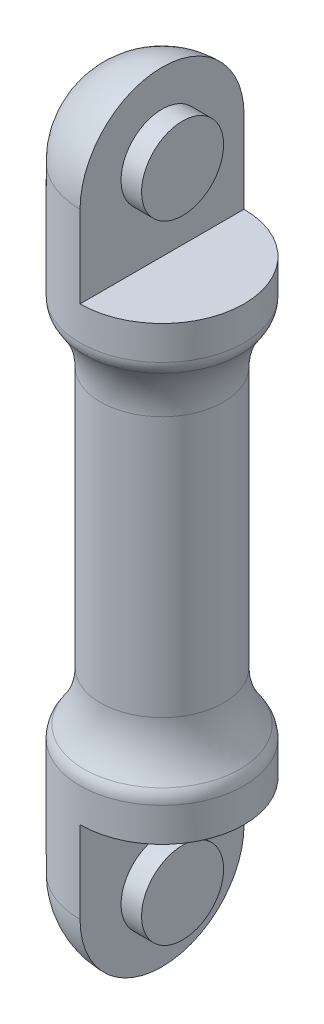
ISO-10303-21;
HEADER;
FILE_DESCRIPTION(('STEP AP214'),'2;1');
FILE_NAME('part.step','',(''),(''),'','','');
FILE_SCHEMA(('AUTOMOTIVE_DESIGN { 1 0 10303 214 1 1 1 1 }'));
ENDSEC;
DATA;
#1=APPLICATION_CONTEXT('core data for automotive mechanical design processes');
#2=APPLICATION_PROTOCOL_DEFINITION('international standard','automotive_design',2000,#1);
#3=PRODUCT_CONTEXT('',#1,'mechanical');
#4=PRODUCT('Part','Part','',(#3));
#5=PRODUCT_RELATED_PRODUCT_CATEGORY('part','',(#4));
#6=PRODUCT_DEFINITION_FORMATION('','',#4);
#7=PRODUCT_DEFINITION_CONTEXT('part definition',#1,'design');
#8=PRODUCT_DEFINITION('design','',#6,#7);
#9=PRODUCT_DEFINITION_SHAPE('','',#8);
#10=(LENGTH_UNIT() NAMED_UNIT(*) SI_UNIT(.MILLI.,.METRE.));
#11=(NAMED_UNIT(*) PLANE_ANGLE_UNIT() SI_UNIT($,.RADIAN.));
#12=(NAMED_UNIT(*) SI_UNIT($,.STERADIAN.) SOLID_ANGLE_UNIT());
#13=UNCERTAINTY_MEASURE_WITH_UNIT(LENGTH_MEASURE(1.E-05),#10,'distance_accuracy_value','');
#14=(GEOMETRIC_REPRESENTATION_CONTEXT(3) GLOBAL_UNCERTAINTY_ASSIGNED_CONTEXT((#13)) GLOBAL_UNIT_ASSIGNED_CONTEXT((#10,
#11,#12)) REPRESENTATION_CONTEXT('',''));
#15=CARTESIAN_POINT('',(0.,0.,0.));
#16=DIRECTION('',(0.,0.,1.));
#17=DIRECTION('',(1.,0.,0.));
#18=AXIS2_PLACEMENT_3D('',#15,#16,#17);
#19=CARTESIAN_POINT('',(0.,100.,0.));
#20=DIRECTION('',(0.,-1.,0.));
#21=DIRECTION('',(0.,0.,-1.));
#22=AXIS2_PLACEMENT_3D('',#19,#20,#21);
#23=CYLINDRICAL_SURFACE('',#22,40.);
#24=CARTESIAN_POINT('',(0.,96.4575131106459,0.));
#25=DIRECTION('',(0.,-1.,0.));
#26=DIRECTION('',(0.,0.,-1.));
#27=AXIS2_PLACEMENT_3D('',#24,#25,#26);
#28=CIRCLE('',#27,40.);
#29=CARTESIAN_POINT('',(0.,96.4575131106459,-40.));
#30=VERTEX_POINT('',#29);
#31=EDGE_CURVE('E11',#30,#30,#28,.T.);
#32=ORIENTED_EDGE('',*,*,#31,.T.);
#33=EDGE_LOOP('',(#32));
#34=FACE_BOUND('',#33,.T.);
#35=DIRECTION('',(0.,-1.,0.));
#36=VECTOR('',#35,1.);
#37=CARTESIAN_POINT('',(0.,100.,-40.));
#38=LINE('',#37,#36);
#39=CARTESIAN_POINT('',(0.,80.,-40.));
#40=VERTEX_POINT('',#39);
#41=CARTESIAN_POINT('',(0.,40.,-40.));
#42=VERTEX_POINT('',#41);
#43=EDGE_CURVE('E93',#40,#42,#38,.T.);
#44=ORIENTED_EDGE('',*,*,#43,.T.);
#45=CARTESIAN_POINT('',(0.,40.,0.));
#46=DIRECTION('',(0.,-1.,0.));
#47=DIRECTION('',(0.,0.,-1.));
#48=AXIS2_PLACEMENT_3D('',#45,#46,#47);
#49=CIRCLE('',#48,40.);
#50=CARTESIAN_POINT('',(0.,40.,40.));
#51=VERTEX_POINT('',#50);
#52=EDGE_CURVE('E90',#42,#51,#49,.F.);
#53=ORIENTED_EDGE('',*,*,#52,.T.);
#54=DIRECTION('',(0.,-1.,0.));
#55=VECTOR('',#54,1.);
#56=CARTESIAN_POINT('',(0.,100.,40.));
#57=LINE('',#56,#55);
#58=CARTESIAN_POINT('',(0.,80.,40.));
#59=VERTEX_POINT('',#58);
#60=EDGE_CURVE('E85',#51,#59,#57,.F.);
#61=ORIENTED_EDGE('',*,*,#60,.T.);
#62=CARTESIAN_POINT('',(0.,80.,0.));
#63=DIRECTION('',(0.,1.,0.));
#64=DIRECTION('',(0.,0.,1.));
#65=AXIS2_PLACEMENT_3D('',#62,#63,#64);
#66=CIRCLE('',#65,40.);
#67=EDGE_CURVE('E88',#59,#40,#66,.T.);
#68=ORIENTED_EDGE('',*,*,#67,.T.);
#69=EDGE_LOOP('',(#44,#53,#61,#68));
#70=FACE_BOUND('',#69,.T.);
#71=ADVANCED_FACE('F37',(#34,#70),#23,.T.);
#72=CARTESIAN_POINT('',(0.,280.,0.));
#73=DIRECTION('',(0.,-1.,0.));
#74=DIRECTION('',(0.,0.,-1.));
#75=AXIS2_PLACEMENT_3D('',#72,#73,#74);
#76=CYLINDRICAL_SURFACE('',#75,30.);
#77=CARTESIAN_POINT('',(0.,253.542486889354,0.));
#78=DIRECTION('',(0.,1.,0.));
#79=DIRECTION('',(0.,0.,1.));
#80=AXIS2_PLACEMENT_3D('',#77,#78,#79);
#81=CIRCLE('',#80,30.);
#82=CARTESIAN_POINT('',(0.,253.542486889354,-30.));
#83=VERTEX_POINT('',#82);
#84=EDGE_CURVE('E137',#83,#83,#81,.F.);
#85=CARTESIAN_POINT('',(0.,126.457513110646,0.));
#86=DIRECTION('',(0.,-1.,0.));
#87=DIRECTION('',(0.,0.,-1.));
#88=AXIS2_PLACEMENT_3D('',#85,#86,#87);
#89=CIRCLE('',#88,30.);
#90=CARTESIAN_POINT('',(0.,126.457513110646,-30.));
#91=VERTEX_POINT('',#90);
#92=EDGE_CURVE('E134',#91,#91,#89,.F.);
#93=CARTESIAN_POINT('',(0.,253.542486889354,-30.));
#94=CARTESIAN_POINT('',(0.,252.218685079159,-30.));
#95=CARTESIAN_POINT('',(0.,250.894883268964,-30.));
#96=CARTESIAN_POINT('',(0.,248.247279648575,-30.));
#97=CARTESIAN_POINT('',(0.,246.92347783838,-30.));
#98=CARTESIAN_POINT('',(0.,244.27587421799,-30.));
#99=CARTESIAN_POINT('',(0.,242.952072407795,-30.));
#100=CARTESIAN_POINT('',(0.,240.304468787405,-30.));
#101=CARTESIAN_POINT('',(0.,238.98066697721,-30.));
#102=CARTESIAN_POINT('',(0.,236.333063356821,-30.));
#103=CARTESIAN_POINT('',(0.,235.009261546626,-30.));
#104=CARTESIAN_POINT('',(0.,232.361657926236,-30.));
#105=CARTESIAN_POINT('',(0.,231.037856116041,-30.));
#106=CARTESIAN_POINT('',(0.,228.390252495651,-30.));
#107=CARTESIAN_POINT('',(0.,227.066450685457,-30.));
#108=CARTESIAN_POINT('',(0.,224.418847065067,-30.));
#109=CARTESIAN_POINT('',(0.,223.095045254872,-30.));
#110=CARTESIAN_POINT('',(0.,220.447441634482,-30.));
#111=CARTESIAN_POINT('',(0.,219.123639824287,-30.));
#112=CARTESIAN_POINT('',(0.,216.476036203898,-30.));
#113=CARTESIAN_POINT('',(0.,215.152234393703,-30.));
#114=CARTESIAN_POINT('',(0.,212.504630773313,-30.));
#115=CARTESIAN_POINT('',(0.,211.180828963118,-30.));
#116=CARTESIAN_POINT('',(0.,208.533225342728,-30.));
#117=CARTESIAN_POINT('',(0.,207.209423532533,-30.));
#118=CARTESIAN_POINT('',(0.,204.561819912144,-30.));
#119=CARTESIAN_POINT('',(0.,203.238018101949,-30.));
#120=CARTESIAN_POINT('',(0.,200.590414481559,-30.));
#121=CARTESIAN_POINT('',(0.,199.266612671364,-30.));
#122=CARTESIAN_POINT('',(0.,196.619009050974,-30.));
#123=CARTESIAN_POINT('',(0.,195.29520724078,-30.));
#124=CARTESIAN_POINT('',(0.,192.64760362039,-30.));
#125=CARTESIAN_POINT('',(0.,191.323801810195,-30.));
#126=CARTESIAN_POINT('',(0.,188.676198189805,-30.));
#127=CARTESIAN_POINT('',(0.,187.35239637961,-30.));
#128=CARTESIAN_POINT('',(0.,184.70479275922,-30.));
#129=CARTESIAN_POINT('',(0.,183.380990949026,-30.));
#130=CARTESIAN_POINT('',(0.,180.733387328636,-30.));
#131=CARTESIAN_POINT('',(0.,179.409585518441,-30.));
#132=CARTESIAN_POINT('',(0.,176.761981898051,-30.));
#133=CARTESIAN_POINT('',(0.,175.438180087856,-30.));
#134=CARTESIAN_POINT('',(0.,172.790576467467,-30.));
#135=CARTESIAN_POINT('',(0.,171.466774657272,-30.));
#136=CARTESIAN_POINT('',(0.,168.819171036882,-30.));
#137=CARTESIAN_POINT('',(0.,167.495369226687,-30.));
#138=CARTESIAN_POINT('',(0.,164.847765606297,-30.));
#139=CARTESIAN_POINT('',(0.,163.523963796102,-30.));
#140=CARTESIAN_POINT('',(0.,160.876360175713,-30.));
#141=CARTESIAN_POINT('',(0.,159.552558365518,-30.));
#142=CARTESIAN_POINT('',(0.,156.904954745128,-30.));
#143=CARTESIAN_POINT('',(0.,155.581152934933,-30.));
#144=CARTESIAN_POINT('',(0.,152.933549314543,-30.));
#145=CARTESIAN_POINT('',(0.,151.609747504349,-30.));
#146=CARTESIAN_POINT('',(0.,148.962143883959,-30.));
#147=CARTESIAN_POINT('',(0.,147.638342073764,-30.));
#148=CARTESIAN_POINT('',(0.,144.990738453374,-30.));
#149=CARTESIAN_POINT('',(0.,143.666936643179,-30.));
#150=CARTESIAN_POINT('',(0.,141.01933302279,-30.));
#151=CARTESIAN_POINT('',(0.,139.695531212595,-30.));
#152=CARTESIAN_POINT('',(0.,137.047927592205,-30.));
#153=CARTESIAN_POINT('',(0.,135.72412578201,-30.));
#154=CARTESIAN_POINT('',(0.,133.07652216162,-30.));
#155=CARTESIAN_POINT('',(0.,131.752720351425,-30.));
#156=CARTESIAN_POINT('',(0.,129.105116731036,-30.));
#157=CARTESIAN_POINT('',(0.,127.781314920841,-30.));
#158=CARTESIAN_POINT('',(0.,126.457513110646,-30.));
#159=B_SPLINE_CURVE_WITH_KNOTS('',3,(#93,#94,#95,#96,#97,#98,#99,#100,#101,#102,#103,#104,#105,
#106,#107,#108,#109,#110,#111,#112,#113,#114,#115,#116,#117,#118,#119,#120,#121,#122,#123,#124,
#125,#126,#127,#128,#129,#130,#131,#132,#133,#134,#135,#136,#137,#138,#139,#140,#141,#142,#143,
#144,#145,#146,#147,#148,#149,#150,#151,#152,#153,#154,#155,#156,#157,#158),.UNSPECIFIED.,.F.,
.F.,(4,2,2,2,2,2,2,2,2,2,2,2,2,2,2,2,2,2,2,2,2,2,2,2,2,2,2,2,2,2,2,2,4),(0.,3.97140543058461,
7.94281086116924,11.9142162917539,15.8856217223385,19.8570271529231,23.8284325835078,
27.7998380140924,31.771243444677,35.7426488752616,39.7140543058463,43.6854597364309,
47.6568651670155,51.6282705976002,55.5996760281848,59.5710814587694,63.542486889354,
67.5138923199387,71.4852977505233,75.4567031811079,79.4281086116926,83.3995140422772,
87.3709194728619,91.3423249034465,95.3137303340311,99.2851357646157,103.2565411952,
107.227946625785,111.19935205637,115.170757486954,119.142162917539,123.113568348123,
127.084973778708),.UNSPECIFIED.);
#160=EDGE_CURVE('BSEAM161',#83,#91,#159,.T.);
#161=ORIENTED_EDGE('',*,*,#84,.T.);
#162=ORIENTED_EDGE('',*,*,#92,.T.);
#163=ORIENTED_EDGE('',*,*,#160,.T.);
#164=ORIENTED_EDGE('',*,*,#160,.F.);
#165=EDGE_LOOP('',(#161,#163,#162,#164));
#166=FACE_BOUND('',#165,.T.);
#167=ADVANCED_FACE('F161',(#166),#76,.T.);
#168=CARTESIAN_POINT('',(0.,380.,0.));
#169=DIRECTION('',(0.,-1.,0.));
#170=DIRECTION('',(0.,0.,-1.));
#171=AXIS2_PLACEMENT_3D('',#168,#169,#170);
#172=CYLINDRICAL_SURFACE('',#171,40.);
#173=CARTESIAN_POINT('',(0.,283.542486889354,0.));
#174=DIRECTION('',(0.,-1.,0.));
#175=DIRECTION('',(0.,0.,-1.));
#176=AXIS2_PLACEMENT_3D('',#173,#174,#175);
#177=CIRCLE('',#176,40.);
#178=CARTESIAN_POINT('',(0.,283.542486889354,-40.));
#179=VERTEX_POINT('',#178);
#180=EDGE_CURVE('E140',#179,#179,#177,.F.);
#181=ORIENTED_EDGE('',*,*,#180,.T.);
#182=EDGE_LOOP('',(#181));
#183=FACE_BOUND('',#182,.T.);
#184=DIRECTION('',(0.,-1.,0.));
#185=VECTOR('',#184,1.);
#186=CARTESIAN_POINT('',(0.,380.,40.));
#187=LINE('',#186,#185);
#188=CARTESIAN_POINT('',(0.,300.,40.));
#189=VERTEX_POINT('',#188);
#190=CARTESIAN_POINT('',(0.,340.,40.));
#191=VERTEX_POINT('',#190);
#192=EDGE_CURVE('E113',#189,#191,#187,.F.);
#193=ORIENTED_EDGE('',*,*,#192,.T.);
#194=CARTESIAN_POINT('',(0.,340.,0.));
#195=DIRECTION('',(0.,-1.,0.));
#196=DIRECTION('',(0.,0.,-1.));
#197=AXIS2_PLACEMENT_3D('',#194,#195,#196);
#198=CIRCLE('',#197,40.);
#199=CARTESIAN_POINT('',(0.,340.,-40.));
#200=VERTEX_POINT('',#199);
#201=EDGE_CURVE('E126',#191,#200,#198,.T.);
#202=ORIENTED_EDGE('',*,*,#201,.T.);
#203=DIRECTION('',(0.,-1.,0.));
#204=VECTOR('',#203,1.);
#205=CARTESIAN_POINT('',(0.,380.,-40.));
#206=LINE('',#205,#204);
#207=CARTESIAN_POINT('',(0.,300.,-40.));
#208=VERTEX_POINT('',#207);
#209=EDGE_CURVE('E115',#200,#208,#206,.T.);
#210=ORIENTED_EDGE('',*,*,#209,.T.);
#211=CARTESIAN_POINT('',(0.,300.,0.));
#212=DIRECTION('',(0.,-1.,0.));
#213=DIRECTION('',(0.,0.,-1.));
#214=AXIS2_PLACEMENT_3D('',#211,#212,#213);
#215=CIRCLE('',#214,40.);
#216=EDGE_CURVE('E99',#208,#189,#215,.T.);
#217=ORIENTED_EDGE('',*,*,#216,.T.);
#218=EDGE_LOOP('',(#193,#202,#210,#217));
#219=FACE_BOUND('',#218,.T.);
#220=ADVANCED_FACE('F167',(#183,#219),#172,.T.);
#221=CARTESIAN_POINT('',(0.,300.,0.));
#222=DIRECTION('',(0.,-1.,0.));
#223=DIRECTION('',(0.,0.,-1.));
#224=AXIS2_PLACEMENT_3D('',#221,#222,#223);
#225=PLANE('',#224);
#226=DIRECTION('',(0.,0.,1.));
#227=VECTOR('',#226,1.);
#228=CARTESIAN_POINT('',(0.,300.,-41.0005681953516));
#229=LINE('',#228,#227);
#230=EDGE_CURVE('E110',#208,#189,#229,.T.);
#231=ORIENTED_EDGE('',*,*,#230,.T.);
#232=ORIENTED_EDGE('',*,*,#216,.F.);
#233=EDGE_LOOP('',(#231,#232));
#234=FACE_BOUND('',#233,.T.);
#235=ADVANCED_FACE('F197',(#234),#225,.F.);
#236=CARTESIAN_POINT('',(0.,300.,-41.0005681953516));
#237=DIRECTION('',(-1.,0.,0.));
#238=DIRECTION('',(0.,0.,1.));
#239=AXIS2_PLACEMENT_3D('',#236,#237,#238);
#240=PLANE('',#239);
#241=CARTESIAN_POINT('',(0.,342.283138073623,0.));
#242=DIRECTION('',(-1.,0.,0.));
#243=DIRECTION('',(0.,0.,1.));
#244=AXIS2_PLACEMENT_3D('',#241,#242,#243);
#245=CIRCLE('',#244,20.);
#246=CARTESIAN_POINT('',(0.,342.283138073623,20.));
#247=VERTEX_POINT('',#246);
#248=EDGE_CURVE('E131',#247,#247,#245,.F.);
#249=ORIENTED_EDGE('',*,*,#248,.F.);
#250=EDGE_LOOP('',(#249));
#251=FACE_BOUND('',#250,.T.);
#252=CARTESIAN_POINT('',(0.,340.,0.));
#253=DIRECTION('',(-1.,0.,0.));
#254=DIRECTION('',(0.,0.,1.));
#255=AXIS2_PLACEMENT_3D('',#252,#253,#254);
#256=CIRCLE('',#255,40.);
#257=CARTESIAN_POINT('',(0.,380.,0.));
#258=VERTEX_POINT('',#257);
#259=EDGE_CURVE('E52',#200,#258,#256,.F.);
#260=ORIENTED_EDGE('',*,*,#259,.T.);
#261=CARTESIAN_POINT('',(0.,340.,0.));
#262=DIRECTION('',(-1.,0.,0.));
#263=DIRECTION('',(0.,0.,1.));
#264=AXIS2_PLACEMENT_3D('',#261,#262,#263);
#265=CIRCLE('',#264,40.);
#266=EDGE_CURVE('E58',#258,#191,#265,.F.);
#267=ORIENTED_EDGE('',*,*,#266,.T.);
#268=ORIENTED_EDGE('',*,*,#192,.F.);
#269=ORIENTED_EDGE('',*,*,#230,.F.);
#270=ORIENTED_EDGE('',*,*,#209,.F.);
#271=EDGE_LOOP('',(#260,#267,#268,#269,#270));
#272=FACE_BOUND('',#271,.T.);
#273=ADVANCED_FACE('F201',(#251,#272),#240,.F.);
#274=CARTESIAN_POINT('',(0.,80.,0.));
#275=DIRECTION('',(0.,1.,0.));
#276=DIRECTION('',(0.,0.,1.));
#277=AXIS2_PLACEMENT_3D('',#274,#275,#276);
#278=PLANE('',#277);
#279=DIRECTION('',(0.,0.,-1.));
#280=VECTOR('',#279,1.);
#281=CARTESIAN_POINT('',(0.,80.,40.6899257251112));
#282=LINE('',#281,#280);
#283=EDGE_CURVE('E94',#59,#40,#282,.T.);
#284=ORIENTED_EDGE('',*,*,#283,.T.);
#285=ORIENTED_EDGE('',*,*,#67,.F.);
#286=EDGE_LOOP('',(#284,#285));
#287=FACE_BOUND('',#286,.T.);
#288=ADVANCED_FACE('F98',(#287),#278,.F.);
#289=CARTESIAN_POINT('',(0.,80.,40.6899257251112));
#290=DIRECTION('',(-1.,0.,0.));
#291=DIRECTION('',(0.,0.,1.));
#292=AXIS2_PLACEMENT_3D('',#289,#290,#291);
#293=PLANE('',#292);
#294=CARTESIAN_POINT('',(0.,36.3609950437187,0.));
#295=DIRECTION('',(-1.,0.,0.));
#296=DIRECTION('',(0.,0.,1.));
#297=AXIS2_PLACEMENT_3D('',#294,#295,#296);
#298=CIRCLE('',#297,20.);
#299=CARTESIAN_POINT('',(0.,36.3609950437187,20.));
#300=VERTEX_POINT('',#299);
#301=EDGE_CURVE('E128',#300,#300,#298,.F.);
#302=ORIENTED_EDGE('',*,*,#301,.F.);
#303=EDGE_LOOP('',(#302));
#304=FACE_BOUND('',#303,.T.);
#305=ORIENTED_EDGE('',*,*,#60,.F.);
#306=CARTESIAN_POINT('',(0.,40.,0.));
#307=DIRECTION('',(-1.,0.,0.));
#308=DIRECTION('',(0.,0.,1.));
#309=AXIS2_PLACEMENT_3D('',#306,#307,#308);
#310=CIRCLE('',#309,40.);
#311=CARTESIAN_POINT('',(0.,0.,0.));
#312=VERTEX_POINT('',#311);
#313=EDGE_CURVE('E122',#51,#312,#310,.F.);
#314=ORIENTED_EDGE('',*,*,#313,.T.);
#315=CARTESIAN_POINT('',(0.,40.,0.));
#316=DIRECTION('',(-1.,0.,0.));
#317=DIRECTION('',(0.,0.,1.));
#318=AXIS2_PLACEMENT_3D('',#315,#316,#317);
#319=CIRCLE('',#318,40.);
#320=EDGE_CURVE('E120',#312,#42,#319,.F.);
#321=ORIENTED_EDGE('',*,*,#320,.T.);
#322=ORIENTED_EDGE('',*,*,#43,.F.);
#323=ORIENTED_EDGE('',*,*,#283,.F.);
#324=EDGE_LOOP('',(#305,#314,#321,#322,#323));
#325=FACE_BOUND('',#324,.T.);
#326=ADVANCED_FACE('F101',(#304,#325),#293,.F.);
#327=CARTESIAN_POINT('',(0.,40.,0.));
#328=DIRECTION('',(0.,1.,0.));
#329=DIRECTION('',(0.,0.,1.));
#330=AXIS2_PLACEMENT_3D('',#327,#328,#329);
#331=SPHERICAL_SURFACE('',#330,40.);
#332=ORIENTED_EDGE('',*,*,#52,.F.);
#333=ORIENTED_EDGE('',*,*,#320,.F.);
#334=ORIENTED_EDGE('',*,*,#313,.F.);
#335=EDGE_LOOP('',(#332,#333,#334));
#336=FACE_BOUND('',#335,.T.);
#337=ADVANCED_FACE('F172',(#336),#331,.T.);
#338=CARTESIAN_POINT('',(0.,340.,0.));
#339=DIRECTION('',(0.,1.,0.));
#340=DIRECTION('',(0.,0.,1.));
#341=AXIS2_PLACEMENT_3D('',#338,#339,#340);
#342=SPHERICAL_SURFACE('',#341,40.);
#343=ORIENTED_EDGE('',*,*,#259,.F.);
#344=ORIENTED_EDGE('',*,*,#201,.F.);
#345=ORIENTED_EDGE('',*,*,#266,.F.);
#346=EDGE_LOOP('',(#343,#344,#345));
#347=FACE_BOUND('',#346,.T.);
#348=ADVANCED_FACE('F175',(#347),#342,.T.);
#349=CARTESIAN_POINT('',(10.,36.3609950437187,0.));
#350=DIRECTION('',(-1.,0.,0.));
#351=DIRECTION('',(0.,0.,1.));
#352=AXIS2_PLACEMENT_3D('',#349,#350,#351);
#353=CYLINDRICAL_SURFACE('',#352,20.);
#354=CARTESIAN_POINT('',(10.,36.3609950437187,0.));
#355=DIRECTION('',(1.,0.,0.));
#356=DIRECTION('',(0.,0.,-1.));
#357=AXIS2_PLACEMENT_3D('',#354,#355,#356);
#358=CIRCLE('',#357,20.);
#359=CARTESIAN_POINT('',(10.,36.3609950437187,-20.));
#360=VERTEX_POINT('',#359);
#361=EDGE_CURVE('E102',#360,#360,#358,.T.);
#362=ORIENTED_EDGE('',*,*,#361,.F.);
#363=EDGE_LOOP('',(#362));
#364=FACE_BOUND('',#363,.T.);
#365=ORIENTED_EDGE('',*,*,#301,.T.);
#366=EDGE_LOOP('',(#365));
#367=FACE_BOUND('',#366,.T.);
#368=ADVANCED_FACE('F179',(#364,#367),#353,.T.);
#369=CARTESIAN_POINT('',(10.,36.3609950437187,0.));
#370=DIRECTION('',(1.,0.,0.));
#371=DIRECTION('',(0.,0.,-1.));
#372=AXIS2_PLACEMENT_3D('',#369,#370,#371);
#373=PLANE('',#372);
#374=ORIENTED_EDGE('',*,*,#361,.T.);
#375=EDGE_LOOP('',(#374));
#376=FACE_BOUND('',#375,.T.);
#377=ADVANCED_FACE('F218',(#376),#373,.T.);
#378=CARTESIAN_POINT('',(10.,342.283138073623,0.));
#379=DIRECTION('',(-1.,0.,0.));
#380=DIRECTION('',(0.,0.,1.));
#381=AXIS2_PLACEMENT_3D('',#378,#379,#380);
#382=CYLINDRICAL_SURFACE('',#381,20.);
#383=CARTESIAN_POINT('',(10.,342.283138073623,0.));
#384=DIRECTION('',(1.,0.,0.));
#385=DIRECTION('',(0.,0.,-1.));
#386=AXIS2_PLACEMENT_3D('',#383,#384,#385);
#387=CIRCLE('',#386,20.);
#388=CARTESIAN_POINT('',(10.,342.283138073623,-20.));
#389=VERTEX_POINT('',#388);
#390=EDGE_CURVE('E105',#389,#389,#387,.T.);
#391=ORIENTED_EDGE('',*,*,#390,.F.);
#392=EDGE_LOOP('',(#391));
#393=FACE_BOUND('',#392,.T.);
#394=ORIENTED_EDGE('',*,*,#248,.T.);
#395=EDGE_LOOP('',(#394));
#396=FACE_BOUND('',#395,.T.);
#397=ADVANCED_FACE('F222',(#393,#396),#382,.T.);
#398=CARTESIAN_POINT('',(10.,342.283138073623,0.));
#399=DIRECTION('',(1.,0.,0.));
#400=DIRECTION('',(0.,0.,-1.));
#401=AXIS2_PLACEMENT_3D('',#398,#399,#400);
#402=PLANE('',#401);
#403=ORIENTED_EDGE('',*,*,#390,.T.);
#404=EDGE_LOOP('',(#403));
#405=FACE_BOUND('',#404,.T.);
#406=ADVANCED_FACE('F182',(#405),#402,.T.);
#407=CARTESIAN_POINT('',(0.,126.457513110646,0.));
#408=DIRECTION('',(0.,-1.,0.));
#409=DIRECTION('',(0.,0.,-1.));
#410=AXIS2_PLACEMENT_3D('',#407,#408,#409);
#411=TOROIDAL_SURFACE('',#410,70.,40.);
#412=CARTESIAN_POINT('',(0.,102.457513110646,0.));
#413=DIRECTION('',(0.,1.,0.));
#414=DIRECTION('',(0.,0.,1.));
#415=AXIS2_PLACEMENT_3D('',#412,#413,#414);
#416=CIRCLE('',#415,38.);
#417=CARTESIAN_POINT('',(0.,102.457513110646,38.));
#418=VERTEX_POINT('',#417);
#419=EDGE_CURVE('E45',#418,#418,#416,.T.);
#420=ORIENTED_EDGE('',*,*,#419,.T.);
#421=EDGE_LOOP('',(#420));
#422=FACE_BOUND('',#421,.T.);
#423=ORIENTED_EDGE('',*,*,#92,.F.);
#424=EDGE_LOOP('',(#423));
#425=FACE_BOUND('',#424,.T.);
#426=ADVANCED_FACE('F148',(#422,#425),#411,.F.);
#427=CARTESIAN_POINT('',(0.,253.542486889354,0.));
#428=DIRECTION('',(0.,1.,0.));
#429=DIRECTION('',(0.,0.,1.));
#430=AXIS2_PLACEMENT_3D('',#427,#428,#429);
#431=TOROIDAL_SURFACE('',#430,70.,40.);
#432=CARTESIAN_POINT('',(0.,277.542486889354,0.));
#433=DIRECTION('',(0.,-1.,0.));
#434=DIRECTION('',(0.,0.,-1.));
#435=AXIS2_PLACEMENT_3D('',#432,#433,#434);
#436=CIRCLE('',#435,38.);
#437=CARTESIAN_POINT('',(0.,277.542486889354,-38.));
#438=VERTEX_POINT('',#437);
#439=EDGE_CURVE('E143',#438,#438,#436,.T.);
#440=ORIENTED_EDGE('',*,*,#439,.T.);
#441=EDGE_LOOP('',(#440));
#442=FACE_BOUND('',#441,.T.);
#443=ORIENTED_EDGE('',*,*,#84,.F.);
#444=EDGE_LOOP('',(#443));
#445=FACE_BOUND('',#444,.T.);
#446=ADVANCED_FACE('F157',(#442,#445),#431,.F.);
#447=CARTESIAN_POINT('',(0.,283.542486889354,0.));
#448=DIRECTION('',(0.,-1.,0.));
#449=DIRECTION('',(0.,0.,-1.));
#450=AXIS2_PLACEMENT_3D('',#447,#448,#449);
#451=TOROIDAL_SURFACE('',#450,30.,10.);
#452=ORIENTED_EDGE('',*,*,#439,.F.);
#453=EDGE_LOOP('',(#452));
#454=FACE_BOUND('',#453,.T.);
#455=ORIENTED_EDGE('',*,*,#180,.F.);
#456=EDGE_LOOP('',(#455));
#457=FACE_BOUND('',#456,.T.);
#458=ADVANCED_FACE('F152',(#454,#457),#451,.T.);
#459=CARTESIAN_POINT('',(0.,96.4575131106459,0.));
#460=DIRECTION('',(0.,-1.,0.));
#461=DIRECTION('',(0.,0.,-1.));
#462=AXIS2_PLACEMENT_3D('',#459,#460,#461);
#463=TOROIDAL_SURFACE('',#462,30.,10.);
#464=ORIENTED_EDGE('',*,*,#31,.F.);
#465=EDGE_LOOP('',(#464));
#466=FACE_BOUND('',#465,.T.);
#467=ORIENTED_EDGE('',*,*,#419,.F.);
#468=EDGE_LOOP('',(#467));
#469=FACE_BOUND('',#468,.T.);
#470=ADVANCED_FACE('F39',(#466,#469),#463,.T.);
#471=CLOSED_SHELL('',(#71,#167,#220,#235,#273,#288,#326,#337,#348,#368,#377,#397,#406,#426,#446,
#458,#470));
#472=MANIFOLD_SOLID_BREP('B2',#471);
#473=ADVANCED_BREP_SHAPE_REPRESENTATION('',(#18,#472),#14);
#474=SHAPE_DEFINITION_REPRESENTATION(#9,#473);
ENDSEC;
END-ISO-10303-21;
